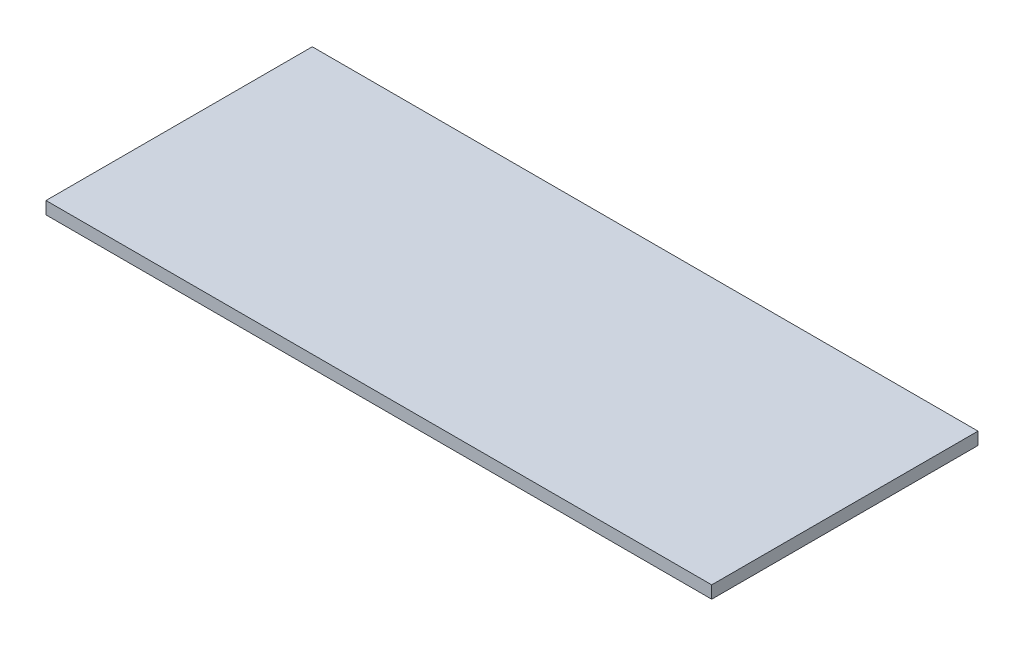
ISO-10303-21;
HEADER;
FILE_DESCRIPTION(('STEP AP214'),'2;1');
FILE_NAME('part.step','',(''),(''),'','','');
FILE_SCHEMA(('AUTOMOTIVE_DESIGN { 1 0 10303 214 1 1 1 1 }'));
ENDSEC;
DATA;
#1=APPLICATION_CONTEXT('core data for automotive mechanical design processes');
#2=APPLICATION_PROTOCOL_DEFINITION('international standard','automotive_design',2000,#1);
#3=PRODUCT_CONTEXT('',#1,'mechanical');
#4=PRODUCT('Part','Part','',(#3));
#5=PRODUCT_RELATED_PRODUCT_CATEGORY('part','',(#4));
#6=PRODUCT_DEFINITION_FORMATION('','',#4);
#7=PRODUCT_DEFINITION_CONTEXT('part definition',#1,'design');
#8=PRODUCT_DEFINITION('design','',#6,#7);
#9=PRODUCT_DEFINITION_SHAPE('','',#8);
#10=(LENGTH_UNIT() NAMED_UNIT(*) SI_UNIT(.MILLI.,.METRE.));
#11=(NAMED_UNIT(*) PLANE_ANGLE_UNIT() SI_UNIT($,.RADIAN.));
#12=(NAMED_UNIT(*) SI_UNIT($,.STERADIAN.) SOLID_ANGLE_UNIT());
#13=UNCERTAINTY_MEASURE_WITH_UNIT(LENGTH_MEASURE(1.E-05),#10,'distance_accuracy_value','');
#14=(GEOMETRIC_REPRESENTATION_CONTEXT(3) GLOBAL_UNCERTAINTY_ASSIGNED_CONTEXT((#13)) GLOBAL_UNIT_ASSIGNED_CONTEXT((#10,
#11,#12)) REPRESENTATION_CONTEXT('',''));
#15=CARTESIAN_POINT('',(0.,0.,0.));
#16=DIRECTION('',(0.,0.,1.));
#17=DIRECTION('',(1.,0.,0.));
#18=AXIS2_PLACEMENT_3D('',#15,#16,#17);
#19=CARTESIAN_POINT('',(0.,4.7625,0.));
#20=DIRECTION('',(1.,0.,0.));
#21=DIRECTION('',(0.,0.,-1.));
#22=AXIS2_PLACEMENT_3D('',#19,#20,#21);
#23=PLANE('',#22);
#24=DIRECTION('',(0.,0.,1.));
#25=VECTOR('',#24,1.);
#26=CARTESIAN_POINT('',(0.,0.,0.));
#27=LINE('',#26,#25);
#28=CARTESIAN_POINT('',(0.,0.,-101.6));
#29=VERTEX_POINT('',#28);
#30=CARTESIAN_POINT('',(0.,0.,0.));
#31=VERTEX_POINT('',#30);
#32=EDGE_CURVE('E102',#29,#31,#27,.T.);
#33=ORIENTED_EDGE('',*,*,#32,.T.);
#34=DIRECTION('',(0.,-1.,0.));
#35=VECTOR('',#34,1.);
#36=CARTESIAN_POINT('',(0.,4.7625,0.));
#37=LINE('',#36,#35);
#38=CARTESIAN_POINT('',(0.,4.7625,0.));
#39=VERTEX_POINT('',#38);
#40=EDGE_CURVE('E11',#39,#31,#37,.T.);
#41=ORIENTED_EDGE('',*,*,#40,.F.);
#42=DIRECTION('',(0.,0.,1.));
#43=VECTOR('',#42,1.);
#44=CARTESIAN_POINT('',(0.,4.7625,0.));
#45=LINE('',#44,#43);
#46=CARTESIAN_POINT('',(0.,4.7625,-101.6));
#47=VERTEX_POINT('',#46);
#48=EDGE_CURVE('E90',#47,#39,#45,.T.);
#49=ORIENTED_EDGE('',*,*,#48,.F.);
#50=DIRECTION('',(0.,-1.,0.));
#51=VECTOR('',#50,1.);
#52=CARTESIAN_POINT('',(0.,4.7625,-101.6));
#53=LINE('',#52,#51);
#54=EDGE_CURVE('E98',#47,#29,#53,.T.);
#55=ORIENTED_EDGE('',*,*,#54,.T.);
#56=EDGE_LOOP('',(#33,#41,#49,#55));
#57=FACE_BOUND('',#56,.T.);
#58=ADVANCED_FACE('F39',(#57),#23,.F.);
#59=CARTESIAN_POINT('',(0.,4.7625,0.));
#60=DIRECTION('',(0.,0.,-1.));
#61=DIRECTION('',(-1.,0.,0.));
#62=AXIS2_PLACEMENT_3D('',#59,#60,#61);
#63=PLANE('',#62);
#64=DIRECTION('',(1.,0.,0.));
#65=VECTOR('',#64,1.);
#66=CARTESIAN_POINT('',(0.,0.,0.));
#67=LINE('',#66,#65);
#68=CARTESIAN_POINT('',(254.,0.,0.));
#69=VERTEX_POINT('',#68);
#70=EDGE_CURVE('E94',#31,#69,#67,.T.);
#71=ORIENTED_EDGE('',*,*,#70,.T.);
#72=DIRECTION('',(0.,-1.,0.));
#73=VECTOR('',#72,1.);
#74=CARTESIAN_POINT('',(254.,4.7625,0.));
#75=LINE('',#74,#73);
#76=CARTESIAN_POINT('',(254.,4.7625,0.));
#77=VERTEX_POINT('',#76);
#78=EDGE_CURVE('E47',#77,#69,#75,.T.);
#79=ORIENTED_EDGE('',*,*,#78,.F.);
#80=DIRECTION('',(1.,0.,0.));
#81=VECTOR('',#80,1.);
#82=CARTESIAN_POINT('',(0.,4.7625,0.));
#83=LINE('',#82,#81);
#84=EDGE_CURVE('E85',#39,#77,#83,.T.);
#85=ORIENTED_EDGE('',*,*,#84,.F.);
#86=ORIENTED_EDGE('',*,*,#40,.T.);
#87=EDGE_LOOP('',(#71,#79,#85,#86));
#88=FACE_BOUND('',#87,.T.);
#89=ADVANCED_FACE('F93',(#88),#63,.F.);
#90=CARTESIAN_POINT('',(254.,4.7625,0.));
#91=DIRECTION('',(-1.,0.,0.));
#92=DIRECTION('',(0.,0.,1.));
#93=AXIS2_PLACEMENT_3D('',#90,#91,#92);
#94=PLANE('',#93);
#95=DIRECTION('',(0.,0.,-1.));
#96=VECTOR('',#95,1.);
#97=CARTESIAN_POINT('',(254.,0.,0.));
#98=LINE('',#97,#96);
#99=CARTESIAN_POINT('',(254.,0.,-101.6));
#100=VERTEX_POINT('',#99);
#101=EDGE_CURVE('E72',#69,#100,#98,.T.);
#102=ORIENTED_EDGE('',*,*,#101,.T.);
#103=DIRECTION('',(0.,-1.,0.));
#104=VECTOR('',#103,1.);
#105=CARTESIAN_POINT('',(254.,4.7625,-101.6));
#106=LINE('',#105,#104);
#107=CARTESIAN_POINT('',(254.,4.7625,-101.6));
#108=VERTEX_POINT('',#107);
#109=EDGE_CURVE('E95',#108,#100,#106,.T.);
#110=ORIENTED_EDGE('',*,*,#109,.F.);
#111=DIRECTION('',(0.,0.,-1.));
#112=VECTOR('',#111,1.);
#113=CARTESIAN_POINT('',(254.,4.7625,0.));
#114=LINE('',#113,#112);
#115=EDGE_CURVE('E88',#77,#108,#114,.T.);
#116=ORIENTED_EDGE('',*,*,#115,.F.);
#117=ORIENTED_EDGE('',*,*,#78,.T.);
#118=EDGE_LOOP('',(#102,#110,#116,#117));
#119=FACE_BOUND('',#118,.T.);
#120=ADVANCED_FACE('F96',(#119),#94,.F.);
#121=CARTESIAN_POINT('',(0.,4.7625,-101.6));
#122=DIRECTION('',(0.,0.,1.));
#123=DIRECTION('',(1.,0.,0.));
#124=AXIS2_PLACEMENT_3D('',#121,#122,#123);
#125=PLANE('',#124);
#126=DIRECTION('',(-1.,0.,0.));
#127=VECTOR('',#126,1.);
#128=CARTESIAN_POINT('',(0.,0.,-101.6));
#129=LINE('',#128,#127);
#130=EDGE_CURVE('E78',#100,#29,#129,.T.);
#131=ORIENTED_EDGE('',*,*,#130,.T.);
#132=ORIENTED_EDGE('',*,*,#54,.F.);
#133=DIRECTION('',(-1.,0.,0.));
#134=VECTOR('',#133,1.);
#135=CARTESIAN_POINT('',(0.,4.7625,-101.6));
#136=LINE('',#135,#134);
#137=EDGE_CURVE('E55',#108,#47,#136,.T.);
#138=ORIENTED_EDGE('',*,*,#137,.F.);
#139=ORIENTED_EDGE('',*,*,#109,.T.);
#140=EDGE_LOOP('',(#131,#132,#138,#139));
#141=FACE_BOUND('',#140,.T.);
#142=ADVANCED_FACE('F109',(#141),#125,.F.);
#143=CARTESIAN_POINT('',(0.,4.7625,0.));
#144=DIRECTION('',(0.,-1.,0.));
#145=DIRECTION('',(0.,0.,-1.));
#146=AXIS2_PLACEMENT_3D('',#143,#144,#145);
#147=PLANE('',#146);
#148=ORIENTED_EDGE('',*,*,#48,.T.);
#149=ORIENTED_EDGE('',*,*,#84,.T.);
#150=ORIENTED_EDGE('',*,*,#115,.T.);
#151=ORIENTED_EDGE('',*,*,#137,.T.);
#152=EDGE_LOOP('',(#148,#149,#150,#151));
#153=FACE_BOUND('',#152,.T.);
#154=ADVANCED_FACE('F86',(#153),#147,.F.);
#155=CARTESIAN_POINT('',(0.,0.,0.));
#156=DIRECTION('',(0.,-1.,0.));
#157=DIRECTION('',(0.,0.,-1.));
#158=AXIS2_PLACEMENT_3D('',#155,#156,#157);
#159=PLANE('',#158);
#160=ORIENTED_EDGE('',*,*,#32,.F.);
#161=ORIENTED_EDGE('',*,*,#130,.F.);
#162=ORIENTED_EDGE('',*,*,#101,.F.);
#163=ORIENTED_EDGE('',*,*,#70,.F.);
#164=EDGE_LOOP('',(#160,#161,#162,#163));
#165=FACE_BOUND('',#164,.T.);
#166=ADVANCED_FACE('F112',(#165),#159,.T.);
#167=CLOSED_SHELL('',(#58,#89,#120,#142,#154,#166));
#168=MANIFOLD_SOLID_BREP('B2',#167);
#169=ADVANCED_BREP_SHAPE_REPRESENTATION('',(#18,#168),#14);
#170=SHAPE_DEFINITION_REPRESENTATION(#9,#169);
ENDSEC;
END-ISO-10303-21;
